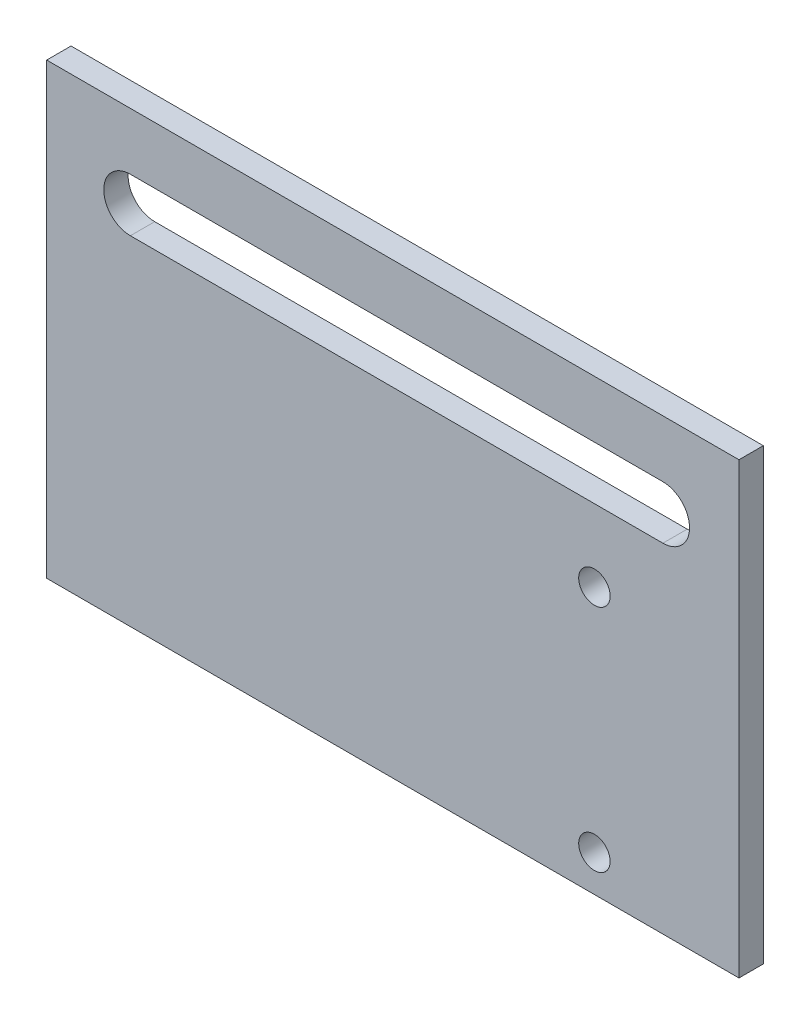
ISO-10303-21;
HEADER;
FILE_DESCRIPTION(('STEP AP214'),'2;1');
FILE_NAME('part.step','',(''),(''),'','','');
FILE_SCHEMA(('AUTOMOTIVE_DESIGN { 1 0 10303 214 1 1 1 1 }'));
ENDSEC;
DATA;
#1=APPLICATION_CONTEXT('core data for automotive mechanical design processes');
#2=APPLICATION_PROTOCOL_DEFINITION('international standard','automotive_design',2000,#1);
#3=PRODUCT_CONTEXT('',#1,'mechanical');
#4=PRODUCT('Part','Part','',(#3));
#5=PRODUCT_RELATED_PRODUCT_CATEGORY('part','',(#4));
#6=PRODUCT_DEFINITION_FORMATION('','',#4);
#7=PRODUCT_DEFINITION_CONTEXT('part definition',#1,'design');
#8=PRODUCT_DEFINITION('design','',#6,#7);
#9=PRODUCT_DEFINITION_SHAPE('','',#8);
#10=(LENGTH_UNIT() NAMED_UNIT(*) SI_UNIT(.MILLI.,.METRE.));
#11=(NAMED_UNIT(*) PLANE_ANGLE_UNIT() SI_UNIT($,.RADIAN.));
#12=(NAMED_UNIT(*) SI_UNIT($,.STERADIAN.) SOLID_ANGLE_UNIT());
#13=UNCERTAINTY_MEASURE_WITH_UNIT(LENGTH_MEASURE(1.E-05),#10,'distance_accuracy_value','');
#14=(GEOMETRIC_REPRESENTATION_CONTEXT(3) GLOBAL_UNCERTAINTY_ASSIGNED_CONTEXT((#13)) GLOBAL_UNIT_ASSIGNED_CONTEXT((#10,
#11,#12)) REPRESENTATION_CONTEXT('',''));
#15=CARTESIAN_POINT('',(0.,0.,0.));
#16=DIRECTION('',(0.,0.,1.));
#17=DIRECTION('',(1.,0.,0.));
#18=AXIS2_PLACEMENT_3D('',#15,#16,#17);
#19=CARTESIAN_POINT('',(0.,0.,3.2));
#20=DIRECTION('',(0.,0.,-1.));
#21=DIRECTION('',(-1.,0.,0.));
#22=AXIS2_PLACEMENT_3D('',#19,#20,#21);
#23=PLANE('',#22);
#24=CARTESIAN_POINT('',(72.,35.,3.2));
#25=DIRECTION('',(0.,0.,1.));
#26=DIRECTION('',(1.,0.,0.));
#27=AXIS2_PLACEMENT_3D('',#24,#25,#26);
#28=CIRCLE('',#27,2.067);
#29=CARTESIAN_POINT('',(74.067,35.,3.2));
#30=VERTEX_POINT('',#29);
#31=EDGE_CURVE('E162',#30,#30,#28,.T.);
#32=ORIENTED_EDGE('',*,*,#31,.F.);
#33=EDGE_LOOP('',(#32));
#34=FACE_BOUND('',#33,.T.);
#35=CARTESIAN_POINT('',(72.,4.8,3.2));
#36=DIRECTION('',(0.,0.,1.));
#37=DIRECTION('',(1.,0.,0.));
#38=AXIS2_PLACEMENT_3D('',#35,#36,#37);
#39=CIRCLE('',#38,2.067);
#40=CARTESIAN_POINT('',(74.067,4.8,3.2));
#41=VERTEX_POINT('',#40);
#42=EDGE_CURVE('E168',#41,#41,#39,.T.);
#43=ORIENTED_EDGE('',*,*,#42,.F.);
#44=EDGE_LOOP('',(#43));
#45=FACE_BOUND('',#44,.T.);
#46=DIRECTION('',(0.,-1.,0.));
#47=VECTOR('',#46,1.);
#48=CARTESIAN_POINT('',(0.,0.,3.2));
#49=LINE('',#48,#47);
#50=CARTESIAN_POINT('',(0.,59.,3.2));
#51=VERTEX_POINT('',#50);
#52=CARTESIAN_POINT('',(0.,0.,3.2));
#53=VERTEX_POINT('',#52);
#54=EDGE_CURVE('E129',#51,#53,#49,.T.);
#55=ORIENTED_EDGE('',*,*,#54,.T.);
#56=DIRECTION('',(1.,0.,0.));
#57=VECTOR('',#56,1.);
#58=CARTESIAN_POINT('',(0.,0.,3.2));
#59=LINE('',#58,#57);
#60=CARTESIAN_POINT('',(91.,0.,3.2));
#61=VERTEX_POINT('',#60);
#62=EDGE_CURVE('E114',#53,#61,#59,.T.);
#63=ORIENTED_EDGE('',*,*,#62,.T.);
#64=DIRECTION('',(0.,1.,0.));
#65=VECTOR('',#64,1.);
#66=CARTESIAN_POINT('',(91.,0.,3.2));
#67=LINE('',#66,#65);
#68=CARTESIAN_POINT('',(91.,59.,3.2));
#69=VERTEX_POINT('',#68);
#70=EDGE_CURVE('E124',#61,#69,#67,.T.);
#71=ORIENTED_EDGE('',*,*,#70,.T.);
#72=DIRECTION('',(-1.,0.,0.));
#73=VECTOR('',#72,1.);
#74=CARTESIAN_POINT('',(0.,59.,3.2));
#75=LINE('',#74,#73);
#76=EDGE_CURVE('E126',#69,#51,#75,.T.);
#77=ORIENTED_EDGE('',*,*,#76,.T.);
#78=EDGE_LOOP('',(#55,#63,#71,#77));
#79=FACE_BOUND('',#78,.T.);
#80=CARTESIAN_POINT('',(11.,48.,3.2));
#81=DIRECTION('',(0.,0.,1.));
#82=DIRECTION('',(1.,0.,0.));
#83=AXIS2_PLACEMENT_3D('',#80,#81,#82);
#84=CIRCLE('',#83,3.5);
#85=CARTESIAN_POINT('',(11.,51.5,3.2));
#86=VERTEX_POINT('',#85);
#87=CARTESIAN_POINT('',(11.,44.5,3.2));
#88=VERTEX_POINT('',#87);
#89=EDGE_CURVE('E166',#86,#88,#84,.T.);
#90=ORIENTED_EDGE('',*,*,#89,.F.);
#91=DIRECTION('',(-1.,0.,0.));
#92=VECTOR('',#91,1.);
#93=CARTESIAN_POINT('',(11.,51.5,3.2));
#94=LINE('',#93,#92);
#95=CARTESIAN_POINT('',(81.,51.5,3.2));
#96=VERTEX_POINT('',#95);
#97=EDGE_CURVE('E182',#96,#86,#94,.T.);
#98=ORIENTED_EDGE('',*,*,#97,.F.);
#99=CARTESIAN_POINT('',(81.,48.,3.2));
#100=DIRECTION('',(0.,0.,1.));
#101=DIRECTION('',(1.,0.,0.));
#102=AXIS2_PLACEMENT_3D('',#99,#100,#101);
#103=CIRCLE('',#102,3.5);
#104=CARTESIAN_POINT('',(81.,44.5,3.2));
#105=VERTEX_POINT('',#104);
#106=EDGE_CURVE('E180',#105,#96,#103,.T.);
#107=ORIENTED_EDGE('',*,*,#106,.F.);
#108=DIRECTION('',(1.,0.,0.));
#109=VECTOR('',#108,1.);
#110=CARTESIAN_POINT('',(11.,44.5,3.2));
#111=LINE('',#110,#109);
#112=EDGE_CURVE('E177',#88,#105,#111,.T.);
#113=ORIENTED_EDGE('',*,*,#112,.F.);
#114=EDGE_LOOP('',(#90,#98,#107,#113));
#115=FACE_BOUND('',#114,.T.);
#116=ADVANCED_FACE('F39',(#34,#45,#79,#115),#23,.F.);
#117=CARTESIAN_POINT('',(0.,0.,0.));
#118=DIRECTION('',(0.,0.,-1.));
#119=DIRECTION('',(-1.,0.,0.));
#120=AXIS2_PLACEMENT_3D('',#117,#118,#119);
#121=PLANE('',#120);
#122=CARTESIAN_POINT('',(72.,35.,0.));
#123=DIRECTION('',(0.,0.,-1.));
#124=DIRECTION('',(-1.,0.,0.));
#125=AXIS2_PLACEMENT_3D('',#122,#123,#124);
#126=CIRCLE('',#125,2.067);
#127=CARTESIAN_POINT('',(74.067,35.,0.));
#128=VERTEX_POINT('',#127);
#129=EDGE_CURVE('E43',#128,#128,#126,.T.);
#130=ORIENTED_EDGE('',*,*,#129,.F.);
#131=EDGE_LOOP('',(#130));
#132=FACE_BOUND('',#131,.T.);
#133=CARTESIAN_POINT('',(72.,4.8,0.));
#134=DIRECTION('',(0.,0.,-1.));
#135=DIRECTION('',(-1.,0.,0.));
#136=AXIS2_PLACEMENT_3D('',#133,#134,#135);
#137=CIRCLE('',#136,2.067);
#138=CARTESIAN_POINT('',(74.067,4.8,0.));
#139=VERTEX_POINT('',#138);
#140=EDGE_CURVE('E160',#139,#139,#137,.T.);
#141=ORIENTED_EDGE('',*,*,#140,.F.);
#142=EDGE_LOOP('',(#141));
#143=FACE_BOUND('',#142,.T.);
#144=DIRECTION('',(0.,-1.,0.));
#145=VECTOR('',#144,1.);
#146=CARTESIAN_POINT('',(0.,0.,0.));
#147=LINE('',#146,#145);
#148=CARTESIAN_POINT('',(0.,59.,0.));
#149=VERTEX_POINT('',#148);
#150=CARTESIAN_POINT('',(0.,0.,0.));
#151=VERTEX_POINT('',#150);
#152=EDGE_CURVE('E147',#149,#151,#147,.T.);
#153=ORIENTED_EDGE('',*,*,#152,.F.);
#154=DIRECTION('',(-1.,0.,0.));
#155=VECTOR('',#154,1.);
#156=CARTESIAN_POINT('',(0.,59.,0.));
#157=LINE('',#156,#155);
#158=CARTESIAN_POINT('',(91.,59.,0.));
#159=VERTEX_POINT('',#158);
#160=EDGE_CURVE('E106',#159,#149,#157,.T.);
#161=ORIENTED_EDGE('',*,*,#160,.F.);
#162=DIRECTION('',(0.,1.,0.));
#163=VECTOR('',#162,1.);
#164=CARTESIAN_POINT('',(91.,0.,0.));
#165=LINE('',#164,#163);
#166=CARTESIAN_POINT('',(91.,0.,0.));
#167=VERTEX_POINT('',#166);
#168=EDGE_CURVE('E99',#167,#159,#165,.T.);
#169=ORIENTED_EDGE('',*,*,#168,.F.);
#170=DIRECTION('',(1.,0.,0.));
#171=VECTOR('',#170,1.);
#172=CARTESIAN_POINT('',(0.,0.,0.));
#173=LINE('',#172,#171);
#174=EDGE_CURVE('E89',#151,#167,#173,.T.);
#175=ORIENTED_EDGE('',*,*,#174,.F.);
#176=EDGE_LOOP('',(#153,#161,#169,#175));
#177=FACE_BOUND('',#176,.T.);
#178=DIRECTION('',(-1.,0.,0.));
#179=VECTOR('',#178,1.);
#180=CARTESIAN_POINT('',(0.,51.5,0.));
#181=LINE('',#180,#179);
#182=CARTESIAN_POINT('',(81.,51.5,0.));
#183=VERTEX_POINT('',#182);
#184=CARTESIAN_POINT('',(11.,51.5,0.));
#185=VERTEX_POINT('',#184);
#186=EDGE_CURVE('E156',#183,#185,#181,.T.);
#187=ORIENTED_EDGE('',*,*,#186,.T.);
#188=CARTESIAN_POINT('',(11.,48.,0.));
#189=DIRECTION('',(0.,0.,-1.));
#190=DIRECTION('',(-1.,0.,0.));
#191=AXIS2_PLACEMENT_3D('',#188,#189,#190);
#192=CIRCLE('',#191,3.5);
#193=CARTESIAN_POINT('',(11.,44.5,0.));
#194=VERTEX_POINT('',#193);
#195=EDGE_CURVE('E11',#185,#194,#192,.F.);
#196=ORIENTED_EDGE('',*,*,#195,.T.);
#197=DIRECTION('',(-1.,0.,0.));
#198=VECTOR('',#197,1.);
#199=CARTESIAN_POINT('',(0.,44.5,0.));
#200=LINE('',#199,#198);
#201=CARTESIAN_POINT('',(81.,44.5,0.));
#202=VERTEX_POINT('',#201);
#203=EDGE_CURVE('E49',#194,#202,#200,.F.);
#204=ORIENTED_EDGE('',*,*,#203,.T.);
#205=CARTESIAN_POINT('',(81.,48.,0.));
#206=DIRECTION('',(0.,0.,-1.));
#207=DIRECTION('',(-1.,0.,0.));
#208=AXIS2_PLACEMENT_3D('',#205,#206,#207);
#209=CIRCLE('',#208,3.5);
#210=EDGE_CURVE('E74',#202,#183,#209,.F.);
#211=ORIENTED_EDGE('',*,*,#210,.T.);
#212=EDGE_LOOP('',(#187,#196,#204,#211));
#213=FACE_BOUND('',#212,.T.);
#214=ADVANCED_FACE('F193',(#132,#143,#177,#213),#121,.T.);
#215=CARTESIAN_POINT('',(0.,0.,3.2));
#216=DIRECTION('',(1.,0.,0.));
#217=DIRECTION('',(0.,0.,-1.));
#218=AXIS2_PLACEMENT_3D('',#215,#216,#217);
#219=PLANE('',#218);
#220=ORIENTED_EDGE('',*,*,#152,.T.);
#221=DIRECTION('',(0.,0.,-1.));
#222=VECTOR('',#221,1.);
#223=CARTESIAN_POINT('',(0.,0.,3.2));
#224=LINE('',#223,#222);
#225=EDGE_CURVE('E138',#53,#151,#224,.T.);
#226=ORIENTED_EDGE('',*,*,#225,.F.);
#227=ORIENTED_EDGE('',*,*,#54,.F.);
#228=DIRECTION('',(0.,0.,-1.));
#229=VECTOR('',#228,1.);
#230=CARTESIAN_POINT('',(0.,59.,3.2));
#231=LINE('',#230,#229);
#232=EDGE_CURVE('E131',#51,#149,#231,.T.);
#233=ORIENTED_EDGE('',*,*,#232,.T.);
#234=EDGE_LOOP('',(#220,#226,#227,#233));
#235=FACE_BOUND('',#234,.T.);
#236=ADVANCED_FACE('F41',(#235),#219,.F.);
#237=CARTESIAN_POINT('',(0.,0.,3.2));
#238=DIRECTION('',(0.,1.,0.));
#239=DIRECTION('',(0.,0.,1.));
#240=AXIS2_PLACEMENT_3D('',#237,#238,#239);
#241=PLANE('',#240);
#242=ORIENTED_EDGE('',*,*,#174,.T.);
#243=DIRECTION('',(0.,0.,-1.));
#244=VECTOR('',#243,1.);
#245=CARTESIAN_POINT('',(91.,0.,3.2));
#246=LINE('',#245,#244);
#247=EDGE_CURVE('E153',#61,#167,#246,.T.);
#248=ORIENTED_EDGE('',*,*,#247,.F.);
#249=ORIENTED_EDGE('',*,*,#62,.F.);
#250=ORIENTED_EDGE('',*,*,#225,.T.);
#251=EDGE_LOOP('',(#242,#248,#249,#250));
#252=FACE_BOUND('',#251,.T.);
#253=ADVANCED_FACE('F226',(#252),#241,.F.);
#254=CARTESIAN_POINT('',(91.,0.,3.2));
#255=DIRECTION('',(-1.,0.,0.));
#256=DIRECTION('',(0.,0.,1.));
#257=AXIS2_PLACEMENT_3D('',#254,#255,#256);
#258=PLANE('',#257);
#259=ORIENTED_EDGE('',*,*,#168,.T.);
#260=DIRECTION('',(0.,0.,-1.));
#261=VECTOR('',#260,1.);
#262=CARTESIAN_POINT('',(91.,59.,3.2));
#263=LINE('',#262,#261);
#264=EDGE_CURVE('E136',#69,#159,#263,.T.);
#265=ORIENTED_EDGE('',*,*,#264,.F.);
#266=ORIENTED_EDGE('',*,*,#70,.F.);
#267=ORIENTED_EDGE('',*,*,#247,.T.);
#268=EDGE_LOOP('',(#259,#265,#266,#267));
#269=FACE_BOUND('',#268,.T.);
#270=ADVANCED_FACE('F224',(#269),#258,.F.);
#271=CARTESIAN_POINT('',(0.,59.,3.2));
#272=DIRECTION('',(0.,-1.,0.));
#273=DIRECTION('',(0.,0.,-1.));
#274=AXIS2_PLACEMENT_3D('',#271,#272,#273);
#275=PLANE('',#274);
#276=ORIENTED_EDGE('',*,*,#160,.T.);
#277=ORIENTED_EDGE('',*,*,#232,.F.);
#278=ORIENTED_EDGE('',*,*,#76,.F.);
#279=ORIENTED_EDGE('',*,*,#264,.T.);
#280=EDGE_LOOP('',(#276,#277,#278,#279));
#281=FACE_BOUND('',#280,.T.);
#282=ADVANCED_FACE('F133',(#281),#275,.F.);
#283=CARTESIAN_POINT('',(11.,48.,3.2));
#284=DIRECTION('',(0.,0.,-1.));
#285=DIRECTION('',(-1.,0.,0.));
#286=AXIS2_PLACEMENT_3D('',#283,#284,#285);
#287=CYLINDRICAL_SURFACE('',#286,3.5);
#288=DIRECTION('',(0.,0.,-1.));
#289=VECTOR('',#288,1.);
#290=CARTESIAN_POINT('',(11.,51.5,3.2));
#291=LINE('',#290,#289);
#292=EDGE_CURVE('E184',#86,#185,#291,.T.);
#293=ORIENTED_EDGE('',*,*,#292,.F.);
#294=ORIENTED_EDGE('',*,*,#89,.T.);
#295=DIRECTION('',(0.,0.,-1.));
#296=VECTOR('',#295,1.);
#297=CARTESIAN_POINT('',(11.,44.5,3.2));
#298=LINE('',#297,#296);
#299=EDGE_CURVE('E149',#88,#194,#298,.T.);
#300=ORIENTED_EDGE('',*,*,#299,.T.);
#301=ORIENTED_EDGE('',*,*,#195,.F.);
#302=EDGE_LOOP('',(#293,#294,#300,#301));
#303=FACE_BOUND('',#302,.T.);
#304=ADVANCED_FACE('F195',(#303),#287,.F.);
#305=CARTESIAN_POINT('',(11.,44.5,3.2));
#306=DIRECTION('',(0.,1.,0.));
#307=DIRECTION('',(0.,0.,1.));
#308=AXIS2_PLACEMENT_3D('',#305,#306,#307);
#309=PLANE('',#308);
#310=ORIENTED_EDGE('',*,*,#299,.F.);
#311=ORIENTED_EDGE('',*,*,#112,.T.);
#312=DIRECTION('',(0.,0.,-1.));
#313=VECTOR('',#312,1.);
#314=CARTESIAN_POINT('',(81.,44.5,3.2));
#315=LINE('',#314,#313);
#316=EDGE_CURVE('E143',#105,#202,#315,.T.);
#317=ORIENTED_EDGE('',*,*,#316,.T.);
#318=ORIENTED_EDGE('',*,*,#203,.F.);
#319=EDGE_LOOP('',(#310,#311,#317,#318));
#320=FACE_BOUND('',#319,.T.);
#321=ADVANCED_FACE('F188',(#320),#309,.T.);
#322=CARTESIAN_POINT('',(81.,48.,3.2));
#323=DIRECTION('',(0.,0.,-1.));
#324=DIRECTION('',(-1.,0.,0.));
#325=AXIS2_PLACEMENT_3D('',#322,#323,#324);
#326=CYLINDRICAL_SURFACE('',#325,3.5);
#327=ORIENTED_EDGE('',*,*,#316,.F.);
#328=ORIENTED_EDGE('',*,*,#106,.T.);
#329=DIRECTION('',(0.,0.,-1.));
#330=VECTOR('',#329,1.);
#331=CARTESIAN_POINT('',(81.,51.5,3.2));
#332=LINE('',#331,#330);
#333=EDGE_CURVE('E58',#96,#183,#332,.T.);
#334=ORIENTED_EDGE('',*,*,#333,.T.);
#335=ORIENTED_EDGE('',*,*,#210,.F.);
#336=EDGE_LOOP('',(#327,#328,#334,#335));
#337=FACE_BOUND('',#336,.T.);
#338=ADVANCED_FACE('F200',(#337),#326,.F.);
#339=CARTESIAN_POINT('',(11.,51.5,3.2));
#340=DIRECTION('',(0.,-1.,0.));
#341=DIRECTION('',(0.,0.,-1.));
#342=AXIS2_PLACEMENT_3D('',#339,#340,#341);
#343=PLANE('',#342);
#344=ORIENTED_EDGE('',*,*,#333,.F.);
#345=ORIENTED_EDGE('',*,*,#97,.T.);
#346=ORIENTED_EDGE('',*,*,#292,.T.);
#347=ORIENTED_EDGE('',*,*,#186,.F.);
#348=EDGE_LOOP('',(#344,#345,#346,#347));
#349=FACE_BOUND('',#348,.T.);
#350=ADVANCED_FACE('F202',(#349),#343,.T.);
#351=CARTESIAN_POINT('',(72.,4.8,-1.2E-05));
#352=DIRECTION('',(0.,0.,1.));
#353=DIRECTION('',(1.,0.,0.));
#354=AXIS2_PLACEMENT_3D('',#351,#352,#353);
#355=CYLINDRICAL_SURFACE('',#354,2.067);
#356=CARTESIAN_POINT('',(74.067,4.8,0.));
#357=CARTESIAN_POINT('',(74.067,4.8,0.0333333333333333));
#358=CARTESIAN_POINT('',(74.067,4.8,0.0666666666666667));
#359=CARTESIAN_POINT('',(74.067,4.8,0.133333333333333));
#360=CARTESIAN_POINT('',(74.067,4.8,0.166666666666667));
#361=CARTESIAN_POINT('',(74.067,4.8,0.233333333333333));
#362=CARTESIAN_POINT('',(74.067,4.8,0.266666666666667));
#363=CARTESIAN_POINT('',(74.067,4.8,0.333333333333333));
#364=CARTESIAN_POINT('',(74.067,4.8,0.366666666666667));
#365=CARTESIAN_POINT('',(74.067,4.8,0.433333333333333));
#366=CARTESIAN_POINT('',(74.067,4.8,0.466666666666667));
#367=CARTESIAN_POINT('',(74.067,4.8,0.533333333333333));
#368=CARTESIAN_POINT('',(74.067,4.8,0.566666666666667));
#369=CARTESIAN_POINT('',(74.067,4.8,0.633333333333333));
#370=CARTESIAN_POINT('',(74.067,4.8,0.666666666666667));
#371=CARTESIAN_POINT('',(74.067,4.8,0.733333333333333));
#372=CARTESIAN_POINT('',(74.067,4.8,0.766666666666667));
#373=CARTESIAN_POINT('',(74.067,4.8,0.833333333333333));
#374=CARTESIAN_POINT('',(74.067,4.8,0.866666666666667));
#375=CARTESIAN_POINT('',(74.067,4.8,0.933333333333333));
#376=CARTESIAN_POINT('',(74.067,4.8,0.966666666666667));
#377=CARTESIAN_POINT('',(74.067,4.8,1.03333333333333));
#378=CARTESIAN_POINT('',(74.067,4.8,1.06666666666667));
#379=CARTESIAN_POINT('',(74.067,4.8,1.13333333333333));
#380=CARTESIAN_POINT('',(74.067,4.8,1.16666666666667));
#381=CARTESIAN_POINT('',(74.067,4.8,1.23333333333333));
#382=CARTESIAN_POINT('',(74.067,4.8,1.26666666666667));
#383=CARTESIAN_POINT('',(74.067,4.8,1.33333333333333));
#384=CARTESIAN_POINT('',(74.067,4.8,1.36666666666667));
#385=CARTESIAN_POINT('',(74.067,4.8,1.43333333333333));
#386=CARTESIAN_POINT('',(74.067,4.8,1.46666666666667));
#387=CARTESIAN_POINT('',(74.067,4.8,1.53333333333333));
#388=CARTESIAN_POINT('',(74.067,4.8,1.56666666666667));
#389=CARTESIAN_POINT('',(74.067,4.8,1.63333333333333));
#390=CARTESIAN_POINT('',(74.067,4.8,1.66666666666667));
#391=CARTESIAN_POINT('',(74.067,4.8,1.73333333333333));
#392=CARTESIAN_POINT('',(74.067,4.8,1.76666666666667));
#393=CARTESIAN_POINT('',(74.067,4.8,1.83333333333333));
#394=CARTESIAN_POINT('',(74.067,4.8,1.86666666666667));
#395=CARTESIAN_POINT('',(74.067,4.8,1.93333333333333));
#396=CARTESIAN_POINT('',(74.067,4.8,1.96666666666667));
#397=CARTESIAN_POINT('',(74.067,4.8,2.03333333333333));
#398=CARTESIAN_POINT('',(74.067,4.8,2.06666666666667));
#399=CARTESIAN_POINT('',(74.067,4.8,2.13333333333333));
#400=CARTESIAN_POINT('',(74.067,4.8,2.16666666666667));
#401=CARTESIAN_POINT('',(74.067,4.8,2.23333333333333));
#402=CARTESIAN_POINT('',(74.067,4.8,2.26666666666667));
#403=CARTESIAN_POINT('',(74.067,4.8,2.33333333333333));
#404=CARTESIAN_POINT('',(74.067,4.8,2.36666666666667));
#405=CARTESIAN_POINT('',(74.067,4.8,2.43333333333333));
#406=CARTESIAN_POINT('',(74.067,4.8,2.46666666666667));
#407=CARTESIAN_POINT('',(74.067,4.8,2.53333333333333));
#408=CARTESIAN_POINT('',(74.067,4.8,2.56666666666667));
#409=CARTESIAN_POINT('',(74.067,4.8,2.63333333333333));
#410=CARTESIAN_POINT('',(74.067,4.8,2.66666666666667));
#411=CARTESIAN_POINT('',(74.067,4.8,2.73333333333333));
#412=CARTESIAN_POINT('',(74.067,4.8,2.76666666666667));
#413=CARTESIAN_POINT('',(74.067,4.8,2.83333333333333));
#414=CARTESIAN_POINT('',(74.067,4.8,2.86666666666667));
#415=CARTESIAN_POINT('',(74.067,4.8,2.93333333333333));
#416=CARTESIAN_POINT('',(74.067,4.8,2.96666666666667));
#417=CARTESIAN_POINT('',(74.067,4.8,3.03333333333333));
#418=CARTESIAN_POINT('',(74.067,4.8,3.06666666666667));
#419=CARTESIAN_POINT('',(74.067,4.8,3.13333333333333));
#420=CARTESIAN_POINT('',(74.067,4.8,3.16666666666667));
#421=CARTESIAN_POINT('',(74.067,4.8,3.2));
#422=B_SPLINE_CURVE_WITH_KNOTS('',3,(#356,#357,#358,#359,#360,#361,#362,#363,#364,#365,#366,
#367,#368,#369,#370,#371,#372,#373,#374,#375,#376,#377,#378,#379,#380,#381,#382,#383,#384,#385,
#386,#387,#388,#389,#390,#391,#392,#393,#394,#395,#396,#397,#398,#399,#400,#401,#402,#403,#404,
#405,#406,#407,#408,#409,#410,#411,#412,#413,#414,#415,#416,#417,#418,#419,#420,#421),
.UNSPECIFIED.,.F.,.F.,(4,2,2,2,2,2,2,2,2,2,2,2,2,2,2,2,2,2,2,2,2,2,2,2,2,2,2,2,2,2,2,2,4),(0.,
0.1,0.2,0.3,0.4,0.5,0.6,0.7,0.8,0.9,1.,1.1,1.2,1.3,1.4,1.5,1.6,1.7,1.8,1.9,2.,2.1,2.2,2.3,2.4,
2.5,2.6,2.7,2.8,2.9,3.,3.1,3.2),.UNSPECIFIED.);
#423=EDGE_CURVE('BSEAM208',#139,#41,#422,.T.);
#424=ORIENTED_EDGE('',*,*,#140,.T.);
#425=ORIENTED_EDGE('',*,*,#42,.T.);
#426=ORIENTED_EDGE('',*,*,#423,.T.);
#427=ORIENTED_EDGE('',*,*,#423,.F.);
#428=EDGE_LOOP('',(#424,#426,#425,#427));
#429=FACE_BOUND('',#428,.T.);
#430=ADVANCED_FACE('F208',(#429),#355,.F.);
#431=CARTESIAN_POINT('',(72.,35.,-1.2E-05));
#432=DIRECTION('',(0.,0.,1.));
#433=DIRECTION('',(1.,0.,0.));
#434=AXIS2_PLACEMENT_3D('',#431,#432,#433);
#435=CYLINDRICAL_SURFACE('',#434,2.067);
#436=CARTESIAN_POINT('',(74.067,35.,0.));
#437=CARTESIAN_POINT('',(74.067,35.,0.0333333333333333));
#438=CARTESIAN_POINT('',(74.067,35.,0.0666666666666667));
#439=CARTESIAN_POINT('',(74.067,35.,0.133333333333333));
#440=CARTESIAN_POINT('',(74.067,35.,0.166666666666667));
#441=CARTESIAN_POINT('',(74.067,35.,0.233333333333333));
#442=CARTESIAN_POINT('',(74.067,35.,0.266666666666667));
#443=CARTESIAN_POINT('',(74.067,35.,0.333333333333333));
#444=CARTESIAN_POINT('',(74.067,35.,0.366666666666667));
#445=CARTESIAN_POINT('',(74.067,35.,0.433333333333333));
#446=CARTESIAN_POINT('',(74.067,35.,0.466666666666667));
#447=CARTESIAN_POINT('',(74.067,35.,0.533333333333333));
#448=CARTESIAN_POINT('',(74.067,35.,0.566666666666667));
#449=CARTESIAN_POINT('',(74.067,35.,0.633333333333333));
#450=CARTESIAN_POINT('',(74.067,35.,0.666666666666667));
#451=CARTESIAN_POINT('',(74.067,35.,0.733333333333333));
#452=CARTESIAN_POINT('',(74.067,35.,0.766666666666667));
#453=CARTESIAN_POINT('',(74.067,35.,0.833333333333333));
#454=CARTESIAN_POINT('',(74.067,35.,0.866666666666667));
#455=CARTESIAN_POINT('',(74.067,35.,0.933333333333333));
#456=CARTESIAN_POINT('',(74.067,35.,0.966666666666667));
#457=CARTESIAN_POINT('',(74.067,35.,1.03333333333333));
#458=CARTESIAN_POINT('',(74.067,35.,1.06666666666667));
#459=CARTESIAN_POINT('',(74.067,35.,1.13333333333333));
#460=CARTESIAN_POINT('',(74.067,35.,1.16666666666667));
#461=CARTESIAN_POINT('',(74.067,35.,1.23333333333333));
#462=CARTESIAN_POINT('',(74.067,35.,1.26666666666667));
#463=CARTESIAN_POINT('',(74.067,35.,1.33333333333333));
#464=CARTESIAN_POINT('',(74.067,35.,1.36666666666667));
#465=CARTESIAN_POINT('',(74.067,35.,1.43333333333333));
#466=CARTESIAN_POINT('',(74.067,35.,1.46666666666667));
#467=CARTESIAN_POINT('',(74.067,35.,1.53333333333333));
#468=CARTESIAN_POINT('',(74.067,35.,1.56666666666667));
#469=CARTESIAN_POINT('',(74.067,35.,1.63333333333333));
#470=CARTESIAN_POINT('',(74.067,35.,1.66666666666667));
#471=CARTESIAN_POINT('',(74.067,35.,1.73333333333333));
#472=CARTESIAN_POINT('',(74.067,35.,1.76666666666667));
#473=CARTESIAN_POINT('',(74.067,35.,1.83333333333333));
#474=CARTESIAN_POINT('',(74.067,35.,1.86666666666667));
#475=CARTESIAN_POINT('',(74.067,35.,1.93333333333333));
#476=CARTESIAN_POINT('',(74.067,35.,1.96666666666667));
#477=CARTESIAN_POINT('',(74.067,35.,2.03333333333333));
#478=CARTESIAN_POINT('',(74.067,35.,2.06666666666667));
#479=CARTESIAN_POINT('',(74.067,35.,2.13333333333333));
#480=CARTESIAN_POINT('',(74.067,35.,2.16666666666667));
#481=CARTESIAN_POINT('',(74.067,35.,2.23333333333333));
#482=CARTESIAN_POINT('',(74.067,35.,2.26666666666667));
#483=CARTESIAN_POINT('',(74.067,35.,2.33333333333333));
#484=CARTESIAN_POINT('',(74.067,35.,2.36666666666667));
#485=CARTESIAN_POINT('',(74.067,35.,2.43333333333333));
#486=CARTESIAN_POINT('',(74.067,35.,2.46666666666667));
#487=CARTESIAN_POINT('',(74.067,35.,2.53333333333333));
#488=CARTESIAN_POINT('',(74.067,35.,2.56666666666667));
#489=CARTESIAN_POINT('',(74.067,35.,2.63333333333333));
#490=CARTESIAN_POINT('',(74.067,35.,2.66666666666667));
#491=CARTESIAN_POINT('',(74.067,35.,2.73333333333333));
#492=CARTESIAN_POINT('',(74.067,35.,2.76666666666667));
#493=CARTESIAN_POINT('',(74.067,35.,2.83333333333333));
#494=CARTESIAN_POINT('',(74.067,35.,2.86666666666667));
#495=CARTESIAN_POINT('',(74.067,35.,2.93333333333333));
#496=CARTESIAN_POINT('',(74.067,35.,2.96666666666667));
#497=CARTESIAN_POINT('',(74.067,35.,3.03333333333333));
#498=CARTESIAN_POINT('',(74.067,35.,3.06666666666667));
#499=CARTESIAN_POINT('',(74.067,35.,3.13333333333333));
#500=CARTESIAN_POINT('',(74.067,35.,3.16666666666667));
#501=CARTESIAN_POINT('',(74.067,35.,3.2));
#502=B_SPLINE_CURVE_WITH_KNOTS('',3,(#436,#437,#438,#439,#440,#441,#442,#443,#444,#445,#446,
#447,#448,#449,#450,#451,#452,#453,#454,#455,#456,#457,#458,#459,#460,#461,#462,#463,#464,#465,
#466,#467,#468,#469,#470,#471,#472,#473,#474,#475,#476,#477,#478,#479,#480,#481,#482,#483,#484,
#485,#486,#487,#488,#489,#490,#491,#492,#493,#494,#495,#496,#497,#498,#499,#500,#501),
.UNSPECIFIED.,.F.,.F.,(4,2,2,2,2,2,2,2,2,2,2,2,2,2,2,2,2,2,2,2,2,2,2,2,2,2,2,2,2,2,2,2,4),(0.,
0.1,0.2,0.3,0.4,0.5,0.6,0.7,0.8,0.9,1.,1.1,1.2,1.3,1.4,1.5,1.6,1.7,1.8,1.9,2.,2.1,2.2,2.3,2.4,
2.5,2.6,2.7,2.8,2.9,3.,3.1,3.2),.UNSPECIFIED.);
#503=EDGE_CURVE('BSEAM250',#128,#30,#502,.T.);
#504=ORIENTED_EDGE('',*,*,#129,.T.);
#505=ORIENTED_EDGE('',*,*,#31,.T.);
#506=ORIENTED_EDGE('',*,*,#503,.T.);
#507=ORIENTED_EDGE('',*,*,#503,.F.);
#508=EDGE_LOOP('',(#504,#506,#505,#507));
#509=FACE_BOUND('',#508,.T.);
#510=ADVANCED_FACE('F250',(#509),#435,.F.);
#511=CLOSED_SHELL('',(#116,#214,#236,#253,#270,#282,#304,#321,#338,#350,#430,#510));
#512=MANIFOLD_SOLID_BREP('B2',#511);
#513=ADVANCED_BREP_SHAPE_REPRESENTATION('',(#18,#512),#14);
#514=SHAPE_DEFINITION_REPRESENTATION(#9,#513);
ENDSEC;
END-ISO-10303-21;
